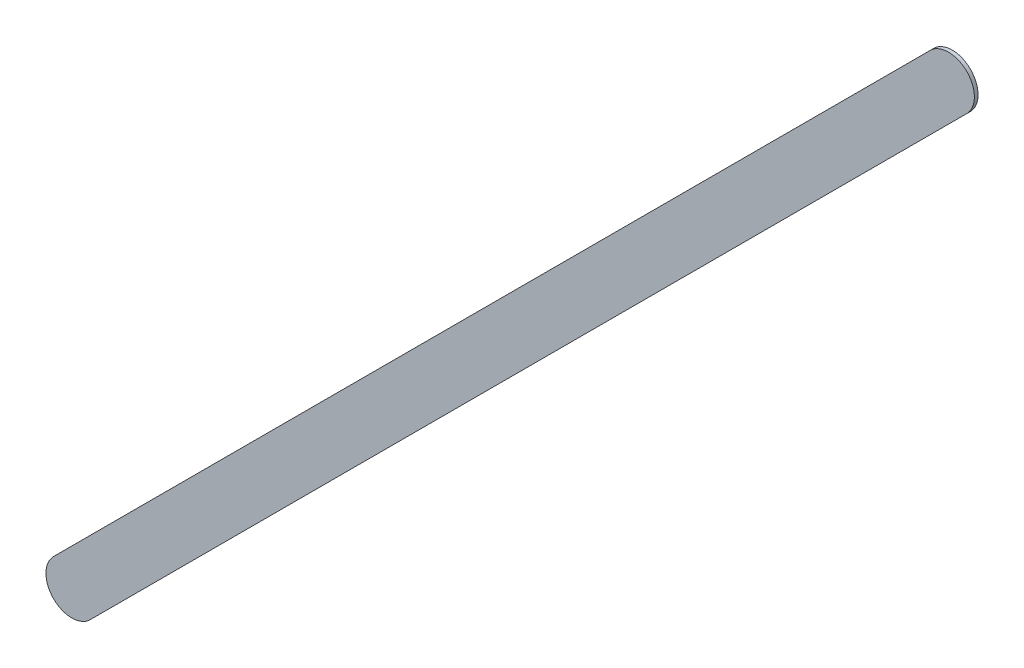
ISO-10303-21;
HEADER;
FILE_DESCRIPTION(('STEP AP214'),'2;1');
FILE_NAME('part.step','',(''),(''),'','','');
FILE_SCHEMA(('AUTOMOTIVE_DESIGN { 1 0 10303 214 1 1 1 1 }'));
ENDSEC;
DATA;
#1=APPLICATION_CONTEXT('core data for automotive mechanical design processes');
#2=APPLICATION_PROTOCOL_DEFINITION('international standard','automotive_design',2000,#1);
#3=PRODUCT_CONTEXT('',#1,'mechanical');
#4=PRODUCT('Part','Part','',(#3));
#5=PRODUCT_RELATED_PRODUCT_CATEGORY('part','',(#4));
#6=PRODUCT_DEFINITION_FORMATION('','',#4);
#7=PRODUCT_DEFINITION_CONTEXT('part definition',#1,'design');
#8=PRODUCT_DEFINITION('design','',#6,#7);
#9=PRODUCT_DEFINITION_SHAPE('','',#8);
#10=(LENGTH_UNIT() NAMED_UNIT(*) SI_UNIT(.MILLI.,.METRE.));
#11=(NAMED_UNIT(*) PLANE_ANGLE_UNIT() SI_UNIT($,.RADIAN.));
#12=(NAMED_UNIT(*) SI_UNIT($,.STERADIAN.) SOLID_ANGLE_UNIT());
#13=UNCERTAINTY_MEASURE_WITH_UNIT(LENGTH_MEASURE(1.E-05),#10,'distance_accuracy_value','');
#14=(GEOMETRIC_REPRESENTATION_CONTEXT(3) GLOBAL_UNCERTAINTY_ASSIGNED_CONTEXT((#13)) GLOBAL_UNIT_ASSIGNED_CONTEXT((#10,
#11,#12)) REPRESENTATION_CONTEXT('',''));
#15=CARTESIAN_POINT('',(0.,0.,0.));
#16=DIRECTION('',(0.,0.,1.));
#17=DIRECTION('',(1.,0.,0.));
#18=AXIS2_PLACEMENT_3D('',#15,#16,#17);
#19=CARTESIAN_POINT('',(34.07677716,105.82322498,0.));
#20=DIRECTION('',(-0.707106781186548,0.707106781186548,0.));
#21=DIRECTION('',(0.707106781186548,0.707106781186548,0.));
#22=AXIS2_PLACEMENT_3D('',#19,#20,#21);
#23=PLANE('',#22);
#24=DIRECTION('',(0.707106781186548,0.707106781186548,0.));
#25=VECTOR('',#24,1.);
#26=CARTESIAN_POINT('',(34.07677716,105.82322498,0.03556));
#27=LINE('',#26,#25);
#28=CARTESIAN_POINT('',(34.07677716,105.82322498,0.03556));
#29=VERTEX_POINT('',#28);
#30=CARTESIAN_POINT('',(42.5647866,114.31123442,0.03556));
#31=VERTEX_POINT('',#30);
#32=EDGE_CURVE('E11',#29,#31,#27,.T.);
#33=ORIENTED_EDGE('',*,*,#32,.F.);
#34=DIRECTION('',(0.,0.,1.));
#35=VECTOR('',#34,1.);
#36=CARTESIAN_POINT('',(34.07677716,105.82322498,0.));
#37=LINE('',#36,#35);
#38=CARTESIAN_POINT('',(34.07677716,105.82322498,0.));
#39=VERTEX_POINT('',#38);
#40=EDGE_CURVE('E24',#39,#29,#37,.T.);
#41=ORIENTED_EDGE('',*,*,#40,.F.);
#42=DIRECTION('',(0.707106781186548,0.707106781186548,0.));
#43=VECTOR('',#42,1.);
#44=CARTESIAN_POINT('',(34.07677716,105.82322498,0.));
#45=LINE('',#44,#43);
#46=CARTESIAN_POINT('',(42.5647866,114.31123442,0.));
#47=VERTEX_POINT('',#46);
#48=EDGE_CURVE('E75',#39,#47,#45,.T.);
#49=ORIENTED_EDGE('',*,*,#48,.T.);
#50=DIRECTION('',(0.,0.,1.));
#51=VECTOR('',#50,1.);
#52=CARTESIAN_POINT('',(42.5647866,114.31123442,0.));
#53=LINE('',#52,#51);
#54=EDGE_CURVE('E37',#47,#31,#53,.T.);
#55=ORIENTED_EDGE('',*,*,#54,.T.);
#56=EDGE_LOOP('',(#33,#41,#49,#55));
#57=FACE_BOUND('',#56,.T.);
#58=ADVANCED_FACE('F17',(#57),#23,.F.);
#59=CARTESIAN_POINT('',(42.38801022,114.4880108,0.));
#60=DIRECTION('',(0.,0.,-1.));
#61=DIRECTION('',(0.707106781186562,-0.707106781186533,0.));
#62=AXIS2_PLACEMENT_3D('',#59,#60,#61);
#63=CYLINDRICAL_SURFACE('',#62,0.249999554103221);
#64=CARTESIAN_POINT('',(42.38801022,114.4880108,0.03556));
#65=DIRECTION('',(0.,0.,1.));
#66=DIRECTION('',(0.707106781186562,-0.707106781186533,0.));
#67=AXIS2_PLACEMENT_3D('',#64,#65,#66);
#68=CIRCLE('',#67,0.249999554103221);
#69=CARTESIAN_POINT('',(42.21123384,114.66478718,0.03556));
#70=VERTEX_POINT('',#69);
#71=EDGE_CURVE('E83',#31,#70,#68,.T.);
#72=ORIENTED_EDGE('',*,*,#71,.F.);
#73=ORIENTED_EDGE('',*,*,#54,.F.);
#74=CARTESIAN_POINT('',(42.38801022,114.4880108,0.));
#75=DIRECTION('',(0.,0.,1.));
#76=DIRECTION('',(0.707106781186562,-0.707106781186533,0.));
#77=AXIS2_PLACEMENT_3D('',#74,#75,#76);
#78=CIRCLE('',#77,0.249999554103221);
#79=CARTESIAN_POINT('',(42.21123384,114.66478718,0.));
#80=VERTEX_POINT('',#79);
#81=EDGE_CURVE('E81',#47,#80,#78,.T.);
#82=ORIENTED_EDGE('',*,*,#81,.T.);
#83=DIRECTION('',(0.,0.,1.));
#84=VECTOR('',#83,1.);
#85=CARTESIAN_POINT('',(42.21123384,114.66478718,0.));
#86=LINE('',#85,#84);
#87=EDGE_CURVE('E67',#80,#70,#86,.T.);
#88=ORIENTED_EDGE('',*,*,#87,.T.);
#89=EDGE_LOOP('',(#72,#73,#82,#88));
#90=FACE_BOUND('',#89,.T.);
#91=ADVANCED_FACE('F89',(#90),#63,.T.);
#92=CARTESIAN_POINT('',(42.21123384,114.66478718,0.));
#93=DIRECTION('',(0.707106781186547,-0.707106781186548,0.));
#94=DIRECTION('',(-0.707106781186548,-0.707106781186547,0.));
#95=AXIS2_PLACEMENT_3D('',#92,#93,#94);
#96=PLANE('',#95);
#97=DIRECTION('',(-0.707106781186548,-0.707106781186547,0.));
#98=VECTOR('',#97,1.);
#99=CARTESIAN_POINT('',(42.21123384,114.66478718,0.03556));
#100=LINE('',#99,#98);
#101=CARTESIAN_POINT('',(33.7232244,106.17677774,0.03556));
#102=VERTEX_POINT('',#101);
#103=EDGE_CURVE('E71',#70,#102,#100,.T.);
#104=ORIENTED_EDGE('',*,*,#103,.F.);
#105=ORIENTED_EDGE('',*,*,#87,.F.);
#106=DIRECTION('',(-0.707106781186548,-0.707106781186547,0.));
#107=VECTOR('',#106,1.);
#108=CARTESIAN_POINT('',(42.21123384,114.66478718,0.));
#109=LINE('',#108,#107);
#110=CARTESIAN_POINT('',(33.7232244,106.17677774,0.));
#111=VERTEX_POINT('',#110);
#112=EDGE_CURVE('E63',#80,#111,#109,.T.);
#113=ORIENTED_EDGE('',*,*,#112,.T.);
#114=DIRECTION('',(0.,0.,1.));
#115=VECTOR('',#114,1.);
#116=CARTESIAN_POINT('',(33.7232244,106.17677774,0.));
#117=LINE('',#116,#115);
#118=EDGE_CURVE('E53',#111,#102,#117,.T.);
#119=ORIENTED_EDGE('',*,*,#118,.T.);
#120=EDGE_LOOP('',(#104,#105,#113,#119));
#121=FACE_BOUND('',#120,.T.);
#122=ADVANCED_FACE('F66',(#121),#96,.F.);
#123=CARTESIAN_POINT('',(33.90000078,106.00000136,0.));
#124=DIRECTION('',(0.,0.,-1.));
#125=DIRECTION('',(-0.707106781186533,0.707106781186562,0.));
#126=AXIS2_PLACEMENT_3D('',#123,#124,#125);
#127=CYLINDRICAL_SURFACE('',#126,0.249999554103225);
#128=CARTESIAN_POINT('',(33.90000078,106.00000136,0.03556));
#129=DIRECTION('',(0.,0.,1.));
#130=DIRECTION('',(-0.707106781186533,0.707106781186562,0.));
#131=AXIS2_PLACEMENT_3D('',#128,#129,#130);
#132=CIRCLE('',#131,0.249999554103225);
#133=EDGE_CURVE('E59',#102,#29,#132,.T.);
#134=ORIENTED_EDGE('',*,*,#133,.F.);
#135=ORIENTED_EDGE('',*,*,#118,.F.);
#136=CARTESIAN_POINT('',(33.90000078,106.00000136,0.));
#137=DIRECTION('',(0.,0.,1.));
#138=DIRECTION('',(-0.707106781186533,0.707106781186562,0.));
#139=AXIS2_PLACEMENT_3D('',#136,#137,#138);
#140=CIRCLE('',#139,0.249999554103225);
#141=EDGE_CURVE('E57',#111,#39,#140,.T.);
#142=ORIENTED_EDGE('',*,*,#141,.T.);
#143=ORIENTED_EDGE('',*,*,#40,.T.);
#144=EDGE_LOOP('',(#134,#135,#142,#143));
#145=FACE_BOUND('',#144,.T.);
#146=ADVANCED_FACE('F55',(#145),#127,.T.);
#147=CARTESIAN_POINT('',(34.07677716,105.82322498,0.));
#148=DIRECTION('',(0.,0.,-1.));
#149=DIRECTION('',(-1.,0.,0.));
#150=AXIS2_PLACEMENT_3D('',#147,#148,#149);
#151=PLANE('',#150);
#152=ORIENTED_EDGE('',*,*,#141,.F.);
#153=ORIENTED_EDGE('',*,*,#112,.F.);
#154=ORIENTED_EDGE('',*,*,#81,.F.);
#155=ORIENTED_EDGE('',*,*,#48,.F.);
#156=EDGE_LOOP('',(#152,#153,#154,#155));
#157=FACE_BOUND('',#156,.T.);
#158=ADVANCED_FACE('F74',(#157),#151,.T.);
#159=CARTESIAN_POINT('',(34.07677716,105.82322498,0.03556));
#160=DIRECTION('',(0.,0.,-1.));
#161=DIRECTION('',(-1.,0.,0.));
#162=AXIS2_PLACEMENT_3D('',#159,#160,#161);
#163=PLANE('',#162);
#164=ORIENTED_EDGE('',*,*,#32,.T.);
#165=ORIENTED_EDGE('',*,*,#71,.T.);
#166=ORIENTED_EDGE('',*,*,#103,.T.);
#167=ORIENTED_EDGE('',*,*,#133,.T.);
#168=EDGE_LOOP('',(#164,#165,#166,#167));
#169=FACE_BOUND('',#168,.T.);
#170=ADVANCED_FACE('F91',(#169),#163,.F.);
#171=CLOSED_SHELL('',(#58,#91,#122,#146,#158,#170));
#172=MANIFOLD_SOLID_BREP('B1',#171);
#173=ADVANCED_BREP_SHAPE_REPRESENTATION('',(#18,#172),#14);
#174=SHAPE_DEFINITION_REPRESENTATION(#9,#173);
ENDSEC;
END-ISO-10303-21;
